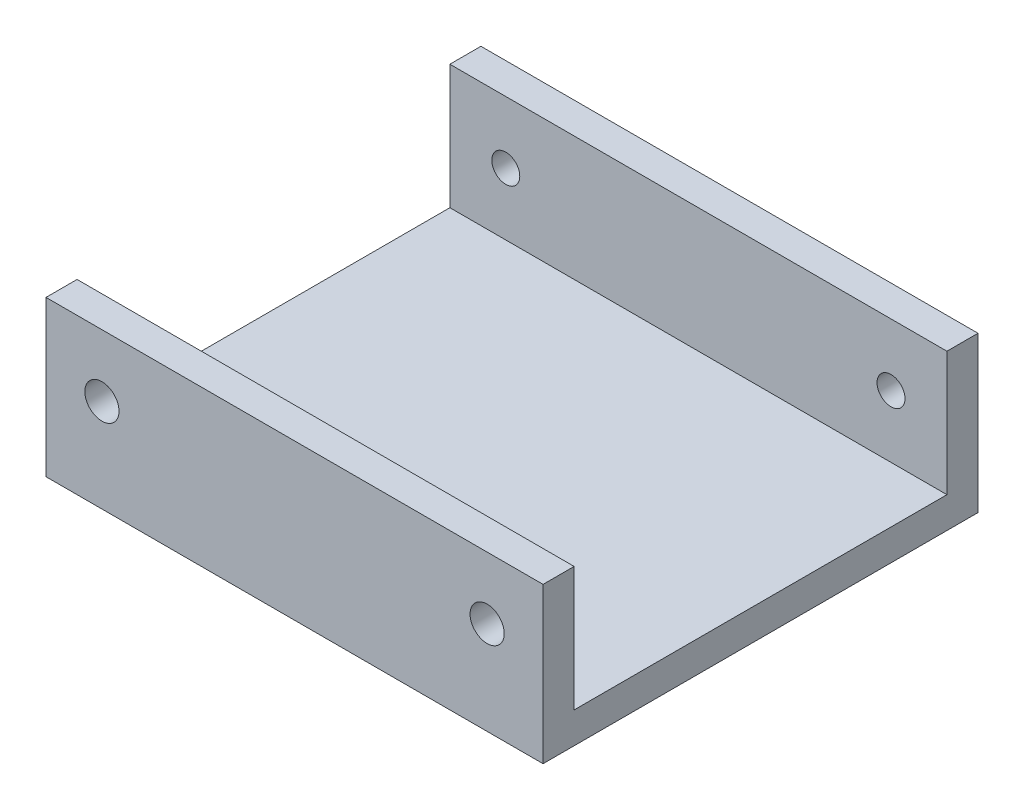
ISO-10303-21;
HEADER;
FILE_DESCRIPTION(('STEP AP214'),'2;1');
FILE_NAME('part.step','',(''),(''),'','','');
FILE_SCHEMA(('AUTOMOTIVE_DESIGN { 1 0 10303 214 1 1 1 1 }'));
ENDSEC;
DATA;
#1=APPLICATION_CONTEXT('core data for automotive mechanical design processes');
#2=APPLICATION_PROTOCOL_DEFINITION('international standard','automotive_design',2000,#1);
#3=PRODUCT_CONTEXT('',#1,'mechanical');
#4=PRODUCT('Part','Part','',(#3));
#5=PRODUCT_RELATED_PRODUCT_CATEGORY('part','',(#4));
#6=PRODUCT_DEFINITION_FORMATION('','',#4);
#7=PRODUCT_DEFINITION_CONTEXT('part definition',#1,'design');
#8=PRODUCT_DEFINITION('design','',#6,#7);
#9=PRODUCT_DEFINITION_SHAPE('','',#8);
#10=(LENGTH_UNIT() NAMED_UNIT(*) SI_UNIT(.MILLI.,.METRE.));
#11=(NAMED_UNIT(*) PLANE_ANGLE_UNIT() SI_UNIT($,.RADIAN.));
#12=(NAMED_UNIT(*) SI_UNIT($,.STERADIAN.) SOLID_ANGLE_UNIT());
#13=UNCERTAINTY_MEASURE_WITH_UNIT(LENGTH_MEASURE(1.E-05),#10,'distance_accuracy_value','');
#14=(GEOMETRIC_REPRESENTATION_CONTEXT(3) GLOBAL_UNCERTAINTY_ASSIGNED_CONTEXT((#13)) GLOBAL_UNIT_ASSIGNED_CONTEXT((#10,
#11,#12)) REPRESENTATION_CONTEXT('',''));
#15=CARTESIAN_POINT('',(0.,0.,0.));
#16=DIRECTION('',(0.,0.,1.));
#17=DIRECTION('',(1.,0.,0.));
#18=AXIS2_PLACEMENT_3D('',#15,#16,#17);
#19=CARTESIAN_POINT('',(0.,0.,5.));
#20=DIRECTION('',(0.,0.,-1.));
#21=DIRECTION('',(-1.,0.,0.));
#22=AXIS2_PLACEMENT_3D('',#19,#20,#21);
#23=PLANE('',#22);
#24=DIRECTION('',(0.,-1.,0.));
#25=VECTOR('',#24,1.);
#26=CARTESIAN_POINT('',(0.,0.,5.));
#27=LINE('',#26,#25);
#28=CARTESIAN_POINT('',(0.,20.,5.));
#29=VERTEX_POINT('',#28);
#30=CARTESIAN_POINT('',(0.,0.,5.));
#31=VERTEX_POINT('',#30);
#32=EDGE_CURVE('E96',#29,#31,#27,.T.);
#33=ORIENTED_EDGE('',*,*,#32,.T.);
#34=DIRECTION('',(1.,0.,0.));
#35=VECTOR('',#34,1.);
#36=CARTESIAN_POINT('',(0.,0.,5.));
#37=LINE('',#36,#35);
#38=CARTESIAN_POINT('',(80.,0.,5.));
#39=VERTEX_POINT('',#38);
#40=EDGE_CURVE('E86',#31,#39,#37,.T.);
#41=ORIENTED_EDGE('',*,*,#40,.T.);
#42=DIRECTION('',(0.,1.,0.));
#43=VECTOR('',#42,1.);
#44=CARTESIAN_POINT('',(80.,0.,5.));
#45=LINE('',#44,#43);
#46=CARTESIAN_POINT('',(80.,20.,5.));
#47=VERTEX_POINT('',#46);
#48=EDGE_CURVE('E95',#39,#47,#45,.T.);
#49=ORIENTED_EDGE('',*,*,#48,.T.);
#50=DIRECTION('',(-1.,0.,0.));
#51=VECTOR('',#50,1.);
#52=CARTESIAN_POINT('',(0.,20.,5.));
#53=LINE('',#52,#51);
#54=EDGE_CURVE('E52',#47,#29,#53,.T.);
#55=ORIENTED_EDGE('',*,*,#54,.T.);
#56=EDGE_LOOP('',(#33,#41,#49,#55));
#57=FACE_BOUND('',#56,.T.);
#58=CARTESIAN_POINT('',(9.,10.,5.));
#59=DIRECTION('',(0.,0.,1.));
#60=DIRECTION('',(1.,0.,0.));
#61=AXIS2_PLACEMENT_3D('',#58,#59,#60);
#62=CIRCLE('',#61,2.25);
#63=CARTESIAN_POINT('',(11.25,10.,5.));
#64=VERTEX_POINT('',#63);
#65=EDGE_CURVE('E106',#64,#64,#62,.T.);
#66=ORIENTED_EDGE('',*,*,#65,.F.);
#67=EDGE_LOOP('',(#66));
#68=FACE_BOUND('',#67,.T.);
#69=CARTESIAN_POINT('',(71.,10.,5.));
#70=DIRECTION('',(0.,0.,1.));
#71=DIRECTION('',(-1.,0.,0.));
#72=AXIS2_PLACEMENT_3D('',#69,#70,#71);
#73=CIRCLE('',#72,2.25);
#74=CARTESIAN_POINT('',(68.75,10.,5.));
#75=VERTEX_POINT('',#74);
#76=EDGE_CURVE('E149',#75,#75,#73,.T.);
#77=ORIENTED_EDGE('',*,*,#76,.F.);
#78=EDGE_LOOP('',(#77));
#79=FACE_BOUND('',#78,.T.);
#80=ADVANCED_FACE('F35',(#57,#68,#79),#23,.F.);
#81=CARTESIAN_POINT('',(0.,0.,0.));
#82=DIRECTION('',(0.,0.,-1.));
#83=DIRECTION('',(-1.,0.,0.));
#84=AXIS2_PLACEMENT_3D('',#81,#82,#83);
#85=PLANE('',#84);
#86=CARTESIAN_POINT('',(9.,10.,0.));
#87=DIRECTION('',(0.,0.,1.));
#88=DIRECTION('',(1.,0.,0.));
#89=AXIS2_PLACEMENT_3D('',#86,#87,#88);
#90=CIRCLE('',#89,2.25);
#91=CARTESIAN_POINT('',(11.25,10.,0.));
#92=VERTEX_POINT('',#91);
#93=EDGE_CURVE('E152',#92,#92,#90,.T.);
#94=ORIENTED_EDGE('',*,*,#93,.T.);
#95=EDGE_LOOP('',(#94));
#96=FACE_BOUND('',#95,.T.);
#97=DIRECTION('',(0.,-1.,0.));
#98=VECTOR('',#97,1.);
#99=CARTESIAN_POINT('',(0.,0.,0.));
#100=LINE('',#99,#98);
#101=CARTESIAN_POINT('',(0.,20.,0.));
#102=VERTEX_POINT('',#101);
#103=CARTESIAN_POINT('',(0.,-5.,0.));
#104=VERTEX_POINT('',#103);
#105=EDGE_CURVE('E103',#102,#104,#100,.T.);
#106=ORIENTED_EDGE('',*,*,#105,.F.);
#107=DIRECTION('',(-1.,0.,0.));
#108=VECTOR('',#107,1.);
#109=CARTESIAN_POINT('',(0.,20.,0.));
#110=LINE('',#109,#108);
#111=CARTESIAN_POINT('',(80.,20.,0.));
#112=VERTEX_POINT('',#111);
#113=EDGE_CURVE('E108',#112,#102,#110,.T.);
#114=ORIENTED_EDGE('',*,*,#113,.F.);
#115=DIRECTION('',(0.,1.,0.));
#116=VECTOR('',#115,1.);
#117=CARTESIAN_POINT('',(80.,0.,0.));
#118=LINE('',#117,#116);
#119=CARTESIAN_POINT('',(80.,-5.,0.));
#120=VERTEX_POINT('',#119);
#121=EDGE_CURVE('E64',#120,#112,#118,.T.);
#122=ORIENTED_EDGE('',*,*,#121,.F.);
#123=DIRECTION('',(1.,0.,0.));
#124=VECTOR('',#123,1.);
#125=CARTESIAN_POINT('',(0.,-5.,0.));
#126=LINE('',#125,#124);
#127=EDGE_CURVE('E120',#104,#120,#126,.T.);
#128=ORIENTED_EDGE('',*,*,#127,.F.);
#129=EDGE_LOOP('',(#106,#114,#122,#128));
#130=FACE_BOUND('',#129,.T.);
#131=CARTESIAN_POINT('',(71.,10.,0.));
#132=DIRECTION('',(0.,0.,1.));
#133=DIRECTION('',(-1.,0.,0.));
#134=AXIS2_PLACEMENT_3D('',#131,#132,#133);
#135=CIRCLE('',#134,2.25);
#136=CARTESIAN_POINT('',(68.75,10.,0.));
#137=VERTEX_POINT('',#136);
#138=EDGE_CURVE('E148',#137,#137,#135,.T.);
#139=ORIENTED_EDGE('',*,*,#138,.T.);
#140=EDGE_LOOP('',(#139));
#141=FACE_BOUND('',#140,.T.);
#142=ADVANCED_FACE('F117',(#96,#130,#141),#85,.T.);
#143=CARTESIAN_POINT('',(0.,0.,5.));
#144=DIRECTION('',(1.,0.,0.));
#145=DIRECTION('',(0.,0.,-1.));
#146=AXIS2_PLACEMENT_3D('',#143,#144,#145);
#147=PLANE('',#146);
#148=ORIENTED_EDGE('',*,*,#105,.T.);
#149=DIRECTION('',(0.,0.,-1.));
#150=VECTOR('',#149,1.);
#151=CARTESIAN_POINT('',(0.,-5.,0.));
#152=LINE('',#151,#150);
#153=CARTESIAN_POINT('',(0.,-5.,70.));
#154=VERTEX_POINT('',#153);
#155=EDGE_CURVE('E92',#154,#104,#152,.T.);
#156=ORIENTED_EDGE('',*,*,#155,.F.);
#157=DIRECTION('',(0.,1.,0.));
#158=VECTOR('',#157,1.);
#159=CARTESIAN_POINT('',(0.,-5.,70.));
#160=LINE('',#159,#158);
#161=CARTESIAN_POINT('',(0.,20.,70.));
#162=VERTEX_POINT('',#161);
#163=EDGE_CURVE('E141',#154,#162,#160,.T.);
#164=ORIENTED_EDGE('',*,*,#163,.T.);
#165=DIRECTION('',(0.,0.,1.));
#166=VECTOR('',#165,1.);
#167=CARTESIAN_POINT('',(0.,20.,65.));
#168=LINE('',#167,#166);
#169=CARTESIAN_POINT('',(0.,20.,65.));
#170=VERTEX_POINT('',#169);
#171=EDGE_CURVE('E142',#170,#162,#168,.T.);
#172=ORIENTED_EDGE('',*,*,#171,.F.);
#173=DIRECTION('',(0.,-1.,0.));
#174=VECTOR('',#173,1.);
#175=CARTESIAN_POINT('',(0.,0.,65.));
#176=LINE('',#175,#174);
#177=CARTESIAN_POINT('',(0.,0.,65.));
#178=VERTEX_POINT('',#177);
#179=EDGE_CURVE('E327',#170,#178,#176,.T.);
#180=ORIENTED_EDGE('',*,*,#179,.T.);
#181=DIRECTION('',(0.,0.,-1.));
#182=VECTOR('',#181,1.);
#183=CARTESIAN_POINT('',(0.,0.,0.));
#184=LINE('',#183,#182);
#185=EDGE_CURVE('E73',#178,#31,#184,.T.);
#186=ORIENTED_EDGE('',*,*,#185,.T.);
#187=ORIENTED_EDGE('',*,*,#32,.F.);
#188=DIRECTION('',(0.,0.,-1.));
#189=VECTOR('',#188,1.);
#190=CARTESIAN_POINT('',(0.,20.,5.));
#191=LINE('',#190,#189);
#192=EDGE_CURVE('E44',#29,#102,#191,.T.);
#193=ORIENTED_EDGE('',*,*,#192,.T.);
#194=EDGE_LOOP('',(#148,#156,#164,#172,#180,#186,#187,#193));
#195=FACE_BOUND('',#194,.T.);
#196=ADVANCED_FACE('F37',(#195),#147,.F.);
#197=CARTESIAN_POINT('',(80.,0.,5.));
#198=DIRECTION('',(-1.,0.,0.));
#199=DIRECTION('',(0.,0.,1.));
#200=AXIS2_PLACEMENT_3D('',#197,#198,#199);
#201=PLANE('',#200);
#202=ORIENTED_EDGE('',*,*,#121,.T.);
#203=DIRECTION('',(0.,0.,-1.));
#204=VECTOR('',#203,1.);
#205=CARTESIAN_POINT('',(80.,20.,5.));
#206=LINE('',#205,#204);
#207=EDGE_CURVE('E11',#47,#112,#206,.T.);
#208=ORIENTED_EDGE('',*,*,#207,.F.);
#209=ORIENTED_EDGE('',*,*,#48,.F.);
#210=DIRECTION('',(0.,0.,1.));
#211=VECTOR('',#210,1.);
#212=CARTESIAN_POINT('',(80.,0.,0.));
#213=LINE('',#212,#211);
#214=CARTESIAN_POINT('',(80.,0.,65.));
#215=VERTEX_POINT('',#214);
#216=EDGE_CURVE('E83',#39,#215,#213,.T.);
#217=ORIENTED_EDGE('',*,*,#216,.T.);
#218=DIRECTION('',(0.,1.,0.));
#219=VECTOR('',#218,1.);
#220=CARTESIAN_POINT('',(80.,0.,65.));
#221=LINE('',#220,#219);
#222=CARTESIAN_POINT('',(80.,20.,65.));
#223=VERTEX_POINT('',#222);
#224=EDGE_CURVE('E330',#215,#223,#221,.T.);
#225=ORIENTED_EDGE('',*,*,#224,.T.);
#226=DIRECTION('',(0.,0.,1.));
#227=VECTOR('',#226,1.);
#228=CARTESIAN_POINT('',(80.,20.,65.));
#229=LINE('',#228,#227);
#230=CARTESIAN_POINT('',(80.,20.,70.));
#231=VERTEX_POINT('',#230);
#232=EDGE_CURVE('E136',#223,#231,#229,.T.);
#233=ORIENTED_EDGE('',*,*,#232,.T.);
#234=DIRECTION('',(0.,1.,0.));
#235=VECTOR('',#234,1.);
#236=CARTESIAN_POINT('',(80.,-5.,70.));
#237=LINE('',#236,#235);
#238=CARTESIAN_POINT('',(80.,-5.,70.));
#239=VERTEX_POINT('',#238);
#240=EDGE_CURVE('E145',#239,#231,#237,.T.);
#241=ORIENTED_EDGE('',*,*,#240,.F.);
#242=DIRECTION('',(0.,0.,1.));
#243=VECTOR('',#242,1.);
#244=CARTESIAN_POINT('',(80.,-5.,0.));
#245=LINE('',#244,#243);
#246=EDGE_CURVE('E127',#120,#239,#245,.T.);
#247=ORIENTED_EDGE('',*,*,#246,.F.);
#248=EDGE_LOOP('',(#202,#208,#209,#217,#225,#233,#241,#247));
#249=FACE_BOUND('',#248,.T.);
#250=ADVANCED_FACE('F98',(#249),#201,.F.);
#251=CARTESIAN_POINT('',(0.,20.,5.));
#252=DIRECTION('',(0.,-1.,0.));
#253=DIRECTION('',(0.,0.,-1.));
#254=AXIS2_PLACEMENT_3D('',#251,#252,#253);
#255=PLANE('',#254);
#256=ORIENTED_EDGE('',*,*,#113,.T.);
#257=ORIENTED_EDGE('',*,*,#192,.F.);
#258=ORIENTED_EDGE('',*,*,#54,.F.);
#259=ORIENTED_EDGE('',*,*,#207,.T.);
#260=EDGE_LOOP('',(#256,#257,#258,#259));
#261=FACE_BOUND('',#260,.T.);
#262=ADVANCED_FACE('F164',(#261),#255,.F.);
#263=CARTESIAN_POINT('',(9.,10.,5.));
#264=DIRECTION('',(0.,0.,-1.));
#265=DIRECTION('',(-1.,0.,0.));
#266=AXIS2_PLACEMENT_3D('',#263,#264,#265);
#267=CYLINDRICAL_SURFACE('',#266,2.25);
#268=ORIENTED_EDGE('',*,*,#65,.T.);
#269=EDGE_LOOP('',(#268));
#270=FACE_BOUND('',#269,.T.);
#271=ORIENTED_EDGE('',*,*,#93,.F.);
#272=EDGE_LOOP('',(#271));
#273=FACE_BOUND('',#272,.T.);
#274=ADVANCED_FACE('F161',(#270,#273),#267,.F.);
#275=CARTESIAN_POINT('',(71.,10.,5.));
#276=DIRECTION('',(0.,0.,-1.));
#277=DIRECTION('',(-1.,0.,0.));
#278=AXIS2_PLACEMENT_3D('',#275,#276,#277);
#279=CYLINDRICAL_SURFACE('',#278,2.25);
#280=ORIENTED_EDGE('',*,*,#76,.T.);
#281=EDGE_LOOP('',(#280));
#282=FACE_BOUND('',#281,.T.);
#283=ORIENTED_EDGE('',*,*,#138,.F.);
#284=EDGE_LOOP('',(#283));
#285=FACE_BOUND('',#284,.T.);
#286=ADVANCED_FACE('F163',(#282,#285),#279,.F.);
#287=CARTESIAN_POINT('',(0.,0.,0.));
#288=DIRECTION('',(0.,1.,0.));
#289=DIRECTION('',(0.,0.,1.));
#290=AXIS2_PLACEMENT_3D('',#287,#288,#289);
#291=PLANE('',#290);
#292=DIRECTION('',(1.,0.,0.));
#293=VECTOR('',#292,1.);
#294=CARTESIAN_POINT('',(0.,0.,65.));
#295=LINE('',#294,#293);
#296=EDGE_CURVE('E89',#178,#215,#295,.T.);
#297=ORIENTED_EDGE('',*,*,#296,.T.);
#298=ORIENTED_EDGE('',*,*,#216,.F.);
#299=ORIENTED_EDGE('',*,*,#40,.F.);
#300=ORIENTED_EDGE('',*,*,#185,.F.);
#301=EDGE_LOOP('',(#297,#298,#299,#300));
#302=FACE_BOUND('',#301,.T.);
#303=ADVANCED_FACE('F85',(#302),#291,.T.);
#304=CARTESIAN_POINT('',(0.,-5.,70.));
#305=DIRECTION('',(0.,0.,-1.));
#306=DIRECTION('',(-1.,0.,0.));
#307=AXIS2_PLACEMENT_3D('',#304,#305,#306);
#308=PLANE('',#307);
#309=ORIENTED_EDGE('',*,*,#240,.T.);
#310=DIRECTION('',(-1.,0.,0.));
#311=VECTOR('',#310,1.);
#312=CARTESIAN_POINT('',(0.,20.,70.));
#313=LINE('',#312,#311);
#314=EDGE_CURVE('E321',#231,#162,#313,.T.);
#315=ORIENTED_EDGE('',*,*,#314,.T.);
#316=ORIENTED_EDGE('',*,*,#163,.F.);
#317=DIRECTION('',(-1.,0.,0.));
#318=VECTOR('',#317,1.);
#319=CARTESIAN_POINT('',(0.,-5.,70.));
#320=LINE('',#319,#318);
#321=EDGE_CURVE('E131',#239,#154,#320,.T.);
#322=ORIENTED_EDGE('',*,*,#321,.F.);
#323=EDGE_LOOP('',(#309,#315,#316,#322));
#324=FACE_BOUND('',#323,.T.);
#325=CARTESIAN_POINT('',(71.,10.,70.));
#326=DIRECTION('',(0.,0.,1.));
#327=DIRECTION('',(-1.,0.,0.));
#328=AXIS2_PLACEMENT_3D('',#325,#326,#327);
#329=CIRCLE('',#328,2.75000000000001);
#330=CARTESIAN_POINT('',(68.25,10.,70.));
#331=VERTEX_POINT('',#330);
#332=EDGE_CURVE('E312',#331,#331,#329,.T.);
#333=ORIENTED_EDGE('',*,*,#332,.F.);
#334=EDGE_LOOP('',(#333));
#335=FACE_BOUND('',#334,.T.);
#336=CARTESIAN_POINT('',(9.,10.,70.));
#337=DIRECTION('',(0.,0.,1.));
#338=DIRECTION('',(1.,0.,0.));
#339=AXIS2_PLACEMENT_3D('',#336,#337,#338);
#340=CIRCLE('',#339,2.75);
#341=CARTESIAN_POINT('',(11.75,10.,70.));
#342=VERTEX_POINT('',#341);
#343=EDGE_CURVE('E315',#342,#342,#340,.T.);
#344=ORIENTED_EDGE('',*,*,#343,.F.);
#345=EDGE_LOOP('',(#344));
#346=FACE_BOUND('',#345,.T.);
#347=ADVANCED_FACE('F205',(#324,#335,#346),#308,.F.);
#348=CARTESIAN_POINT('',(0.,-5.,0.));
#349=DIRECTION('',(0.,1.,0.));
#350=DIRECTION('',(0.,0.,1.));
#351=AXIS2_PLACEMENT_3D('',#348,#349,#350);
#352=PLANE('',#351);
#353=ORIENTED_EDGE('',*,*,#155,.T.);
#354=ORIENTED_EDGE('',*,*,#127,.T.);
#355=ORIENTED_EDGE('',*,*,#246,.T.);
#356=ORIENTED_EDGE('',*,*,#321,.T.);
#357=EDGE_LOOP('',(#353,#354,#355,#356));
#358=FACE_BOUND('',#357,.T.);
#359=ADVANCED_FACE('F129',(#358),#352,.F.);
#360=CARTESIAN_POINT('',(0.,20.,65.));
#361=DIRECTION('',(0.,1.,0.));
#362=DIRECTION('',(-1.,0.,0.));
#363=AXIS2_PLACEMENT_3D('',#360,#361,#362);
#364=PLANE('',#363);
#365=ORIENTED_EDGE('',*,*,#314,.F.);
#366=ORIENTED_EDGE('',*,*,#232,.F.);
#367=DIRECTION('',(-1.,0.,0.));
#368=VECTOR('',#367,1.);
#369=CARTESIAN_POINT('',(0.,20.,65.));
#370=LINE('',#369,#368);
#371=EDGE_CURVE('E332',#223,#170,#370,.T.);
#372=ORIENTED_EDGE('',*,*,#371,.T.);
#373=ORIENTED_EDGE('',*,*,#171,.T.);
#374=EDGE_LOOP('',(#365,#366,#372,#373));
#375=FACE_BOUND('',#374,.T.);
#376=ADVANCED_FACE('F204',(#375),#364,.T.);
#377=CARTESIAN_POINT('',(0.,0.,65.));
#378=DIRECTION('',(0.,0.,-1.));
#379=DIRECTION('',(-1.,0.,0.));
#380=AXIS2_PLACEMENT_3D('',#377,#378,#379);
#381=PLANE('',#380);
#382=CARTESIAN_POINT('',(71.,10.,65.));
#383=DIRECTION('',(0.,0.,1.));
#384=DIRECTION('',(-1.,0.,0.));
#385=AXIS2_PLACEMENT_3D('',#382,#383,#384);
#386=CIRCLE('',#385,2.75000000000001);
#387=CARTESIAN_POINT('',(68.25,10.,65.));
#388=VERTEX_POINT('',#387);
#389=EDGE_CURVE('E318',#388,#388,#386,.T.);
#390=ORIENTED_EDGE('',*,*,#389,.T.);
#391=EDGE_LOOP('',(#390));
#392=FACE_BOUND('',#391,.T.);
#393=CARTESIAN_POINT('',(9.,10.,65.));
#394=DIRECTION('',(0.,0.,1.));
#395=DIRECTION('',(1.,0.,0.));
#396=AXIS2_PLACEMENT_3D('',#393,#394,#395);
#397=CIRCLE('',#396,2.75);
#398=CARTESIAN_POINT('',(11.75,10.,65.));
#399=VERTEX_POINT('',#398);
#400=EDGE_CURVE('E317',#399,#399,#397,.T.);
#401=ORIENTED_EDGE('',*,*,#400,.T.);
#402=EDGE_LOOP('',(#401));
#403=FACE_BOUND('',#402,.T.);
#404=ORIENTED_EDGE('',*,*,#179,.F.);
#405=ORIENTED_EDGE('',*,*,#371,.F.);
#406=ORIENTED_EDGE('',*,*,#224,.F.);
#407=ORIENTED_EDGE('',*,*,#296,.F.);
#408=EDGE_LOOP('',(#404,#405,#406,#407));
#409=FACE_BOUND('',#408,.T.);
#410=ADVANCED_FACE('F219',(#392,#403,#409),#381,.T.);
#411=CARTESIAN_POINT('',(9.,10.,65.));
#412=DIRECTION('',(0.,0.,1.));
#413=DIRECTION('',(1.,0.,0.));
#414=AXIS2_PLACEMENT_3D('',#411,#412,#413);
#415=CYLINDRICAL_SURFACE('',#414,2.75);
#416=ORIENTED_EDGE('',*,*,#400,.F.);
#417=EDGE_LOOP('',(#416));
#418=FACE_BOUND('',#417,.T.);
#419=ORIENTED_EDGE('',*,*,#343,.T.);
#420=EDGE_LOOP('',(#419));
#421=FACE_BOUND('',#420,.T.);
#422=ADVANCED_FACE('F227',(#418,#421),#415,.F.);
#423=CARTESIAN_POINT('',(71.,10.,65.));
#424=DIRECTION('',(0.,0.,1.));
#425=DIRECTION('',(1.,0.,0.));
#426=AXIS2_PLACEMENT_3D('',#423,#424,#425);
#427=CYLINDRICAL_SURFACE('',#426,2.75000000000001);
#428=ORIENTED_EDGE('',*,*,#389,.F.);
#429=EDGE_LOOP('',(#428));
#430=FACE_BOUND('',#429,.T.);
#431=ORIENTED_EDGE('',*,*,#332,.T.);
#432=EDGE_LOOP('',(#431));
#433=FACE_BOUND('',#432,.T.);
#434=ADVANCED_FACE('F235',(#430,#433),#427,.F.);
#435=CLOSED_SHELL('',(#80,#142,#196,#250,#262,#274,#286,#303,#347,#359,#376,#410,#422,#434));
#436=MANIFOLD_SOLID_BREP('B2',#435);
#437=ADVANCED_BREP_SHAPE_REPRESENTATION('',(#18,#436),#14);
#438=SHAPE_DEFINITION_REPRESENTATION(#9,#437);
ENDSEC;
END-ISO-10303-21;
